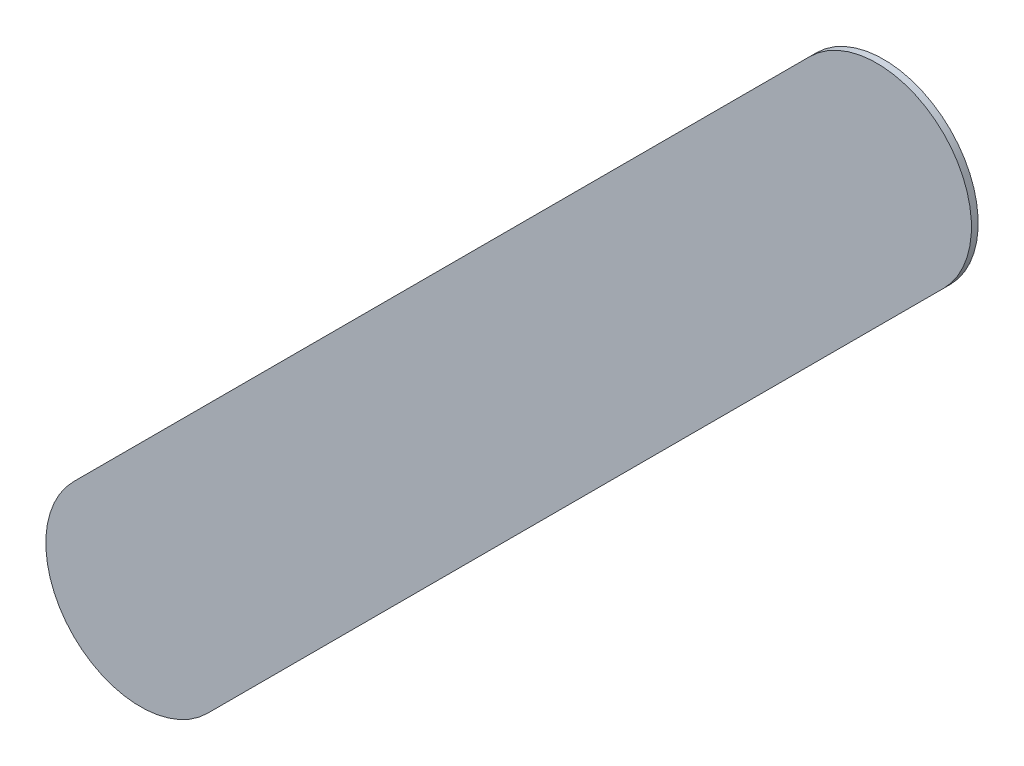
ISO-10303-21;
HEADER;
FILE_DESCRIPTION(('STEP AP214'),'2;1');
FILE_NAME('part.step','',(''),(''),'','','');
FILE_SCHEMA(('AUTOMOTIVE_DESIGN { 1 0 10303 214 1 1 1 1 }'));
ENDSEC;
DATA;
#1=APPLICATION_CONTEXT('core data for automotive mechanical design processes');
#2=APPLICATION_PROTOCOL_DEFINITION('international standard','automotive_design',2000,#1);
#3=PRODUCT_CONTEXT('',#1,'mechanical');
#4=PRODUCT('Part','Part','',(#3));
#5=PRODUCT_RELATED_PRODUCT_CATEGORY('part','',(#4));
#6=PRODUCT_DEFINITION_FORMATION('','',#4);
#7=PRODUCT_DEFINITION_CONTEXT('part definition',#1,'design');
#8=PRODUCT_DEFINITION('design','',#6,#7);
#9=PRODUCT_DEFINITION_SHAPE('','',#8);
#10=(LENGTH_UNIT() NAMED_UNIT(*) SI_UNIT(.MILLI.,.METRE.));
#11=(NAMED_UNIT(*) PLANE_ANGLE_UNIT() SI_UNIT($,.RADIAN.));
#12=(NAMED_UNIT(*) SI_UNIT($,.STERADIAN.) SOLID_ANGLE_UNIT());
#13=UNCERTAINTY_MEASURE_WITH_UNIT(LENGTH_MEASURE(1.E-05),#10,'distance_accuracy_value','');
#14=(GEOMETRIC_REPRESENTATION_CONTEXT(3) GLOBAL_UNCERTAINTY_ASSIGNED_CONTEXT((#13)) GLOBAL_UNIT_ASSIGNED_CONTEXT((#10,
#11,#12)) REPRESENTATION_CONTEXT('',''));
#15=CARTESIAN_POINT('',(0.,0.,0.));
#16=DIRECTION('',(0.,0.,1.));
#17=DIRECTION('',(1.,0.,0.));
#18=AXIS2_PLACEMENT_3D('',#15,#16,#17);
#19=CARTESIAN_POINT('',(35.36272836,117.75563444,0.));
#20=DIRECTION('',(-0.707106781186547,0.707106781186548,0.));
#21=DIRECTION('',(0.707106781186548,0.707106781186547,0.));
#22=AXIS2_PLACEMENT_3D('',#19,#20,#21);
#23=PLANE('',#22);
#24=DIRECTION('',(0.707106781186548,0.707106781186547,0.));
#25=VECTOR('',#24,1.);
#26=CARTESIAN_POINT('',(35.36272836,117.75563444,0.03556));
#27=LINE('',#26,#25);
#28=CARTESIAN_POINT('',(35.36272836,117.75563444,0.03556));
#29=VERTEX_POINT('',#28);
#30=CARTESIAN_POINT('',(39.253541,121.64644708,0.03556));
#31=VERTEX_POINT('',#30);
#32=EDGE_CURVE('E11',#29,#31,#27,.T.);
#33=ORIENTED_EDGE('',*,*,#32,.F.);
#34=DIRECTION('',(0.,0.,1.));
#35=VECTOR('',#34,1.);
#36=CARTESIAN_POINT('',(35.36272836,117.75563444,0.));
#37=LINE('',#36,#35);
#38=CARTESIAN_POINT('',(35.36272836,117.75563444,0.));
#39=VERTEX_POINT('',#38);
#40=EDGE_CURVE('E24',#39,#29,#37,.T.);
#41=ORIENTED_EDGE('',*,*,#40,.F.);
#42=DIRECTION('',(0.707106781186548,0.707106781186547,0.));
#43=VECTOR('',#42,1.);
#44=CARTESIAN_POINT('',(35.36272836,117.75563444,0.));
#45=LINE('',#44,#43);
#46=CARTESIAN_POINT('',(39.253541,121.64644708,0.));
#47=VERTEX_POINT('',#46);
#48=EDGE_CURVE('E75',#39,#47,#45,.T.);
#49=ORIENTED_EDGE('',*,*,#48,.T.);
#50=DIRECTION('',(0.,0.,1.));
#51=VECTOR('',#50,1.);
#52=CARTESIAN_POINT('',(39.253541,121.64644708,0.));
#53=LINE('',#52,#51);
#54=EDGE_CURVE('E37',#47,#31,#53,.T.);
#55=ORIENTED_EDGE('',*,*,#54,.T.);
#56=EDGE_LOOP('',(#33,#41,#49,#55));
#57=FACE_BOUND('',#56,.T.);
#58=ADVANCED_FACE('F17',(#57),#23,.F.);
#59=CARTESIAN_POINT('',(38.89998824,121.99999984,0.));
#60=DIRECTION('',(0.,0.,-1.));
#61=DIRECTION('',(0.707106781186562,-0.707106781186533,0.));
#62=AXIS2_PLACEMENT_3D('',#59,#60,#61);
#63=CYLINDRICAL_SURFACE('',#62,0.499999108206436);
#64=CARTESIAN_POINT('',(38.89998824,121.99999984,0.03556));
#65=DIRECTION('',(0.,0.,1.));
#66=DIRECTION('',(0.707106781186562,-0.707106781186533,0.));
#67=AXIS2_PLACEMENT_3D('',#64,#65,#66);
#68=CIRCLE('',#67,0.499999108206436);
#69=CARTESIAN_POINT('',(38.54643548,122.3535526,0.03556));
#70=VERTEX_POINT('',#69);
#71=EDGE_CURVE('E83',#31,#70,#68,.T.);
#72=ORIENTED_EDGE('',*,*,#71,.F.);
#73=ORIENTED_EDGE('',*,*,#54,.F.);
#74=CARTESIAN_POINT('',(38.89998824,121.99999984,0.));
#75=DIRECTION('',(0.,0.,1.));
#76=DIRECTION('',(0.707106781186562,-0.707106781186533,0.));
#77=AXIS2_PLACEMENT_3D('',#74,#75,#76);
#78=CIRCLE('',#77,0.499999108206436);
#79=CARTESIAN_POINT('',(38.54643548,122.3535526,0.));
#80=VERTEX_POINT('',#79);
#81=EDGE_CURVE('E81',#47,#80,#78,.T.);
#82=ORIENTED_EDGE('',*,*,#81,.T.);
#83=DIRECTION('',(0.,0.,1.));
#84=VECTOR('',#83,1.);
#85=CARTESIAN_POINT('',(38.54643548,122.3535526,0.));
#86=LINE('',#85,#84);
#87=EDGE_CURVE('E67',#80,#70,#86,.T.);
#88=ORIENTED_EDGE('',*,*,#87,.T.);
#89=EDGE_LOOP('',(#72,#73,#82,#88));
#90=FACE_BOUND('',#89,.T.);
#91=ADVANCED_FACE('F89',(#90),#63,.T.);
#92=CARTESIAN_POINT('',(38.54643548,122.3535526,0.));
#93=DIRECTION('',(0.707106781186547,-0.707106781186548,0.));
#94=DIRECTION('',(-0.707106781186548,-0.707106781186547,0.));
#95=AXIS2_PLACEMENT_3D('',#92,#93,#94);
#96=PLANE('',#95);
#97=DIRECTION('',(-0.707106781186548,-0.707106781186547,0.));
#98=VECTOR('',#97,1.);
#99=CARTESIAN_POINT('',(38.54643548,122.3535526,0.03556));
#100=LINE('',#99,#98);
#101=CARTESIAN_POINT('',(34.65562284,118.46273996,0.03556));
#102=VERTEX_POINT('',#101);
#103=EDGE_CURVE('E71',#70,#102,#100,.T.);
#104=ORIENTED_EDGE('',*,*,#103,.F.);
#105=ORIENTED_EDGE('',*,*,#87,.F.);
#106=DIRECTION('',(-0.707106781186548,-0.707106781186547,0.));
#107=VECTOR('',#106,1.);
#108=CARTESIAN_POINT('',(38.54643548,122.3535526,0.));
#109=LINE('',#108,#107);
#110=CARTESIAN_POINT('',(34.65562284,118.46273996,0.));
#111=VERTEX_POINT('',#110);
#112=EDGE_CURVE('E63',#80,#111,#109,.T.);
#113=ORIENTED_EDGE('',*,*,#112,.T.);
#114=DIRECTION('',(0.,0.,1.));
#115=VECTOR('',#114,1.);
#116=CARTESIAN_POINT('',(34.65562284,118.46273996,0.));
#117=LINE('',#116,#115);
#118=EDGE_CURVE('E53',#111,#102,#117,.T.);
#119=ORIENTED_EDGE('',*,*,#118,.T.);
#120=EDGE_LOOP('',(#104,#105,#113,#119));
#121=FACE_BOUND('',#120,.T.);
#122=ADVANCED_FACE('F66',(#121),#96,.F.);
#123=CARTESIAN_POINT('',(35.0091756,118.1091872,0.));
#124=DIRECTION('',(0.,0.,-1.));
#125=DIRECTION('',(-0.707106781186562,0.707106781186533,0.));
#126=AXIS2_PLACEMENT_3D('',#123,#124,#125);
#127=CYLINDRICAL_SURFACE('',#126,0.499999108206436);
#128=CARTESIAN_POINT('',(35.0091756,118.1091872,0.03556));
#129=DIRECTION('',(0.,0.,1.));
#130=DIRECTION('',(-0.707106781186562,0.707106781186533,0.));
#131=AXIS2_PLACEMENT_3D('',#128,#129,#130);
#132=CIRCLE('',#131,0.499999108206436);
#133=EDGE_CURVE('E59',#102,#29,#132,.T.);
#134=ORIENTED_EDGE('',*,*,#133,.F.);
#135=ORIENTED_EDGE('',*,*,#118,.F.);
#136=CARTESIAN_POINT('',(35.0091756,118.1091872,0.));
#137=DIRECTION('',(0.,0.,1.));
#138=DIRECTION('',(-0.707106781186562,0.707106781186533,0.));
#139=AXIS2_PLACEMENT_3D('',#136,#137,#138);
#140=CIRCLE('',#139,0.499999108206436);
#141=EDGE_CURVE('E57',#111,#39,#140,.T.);
#142=ORIENTED_EDGE('',*,*,#141,.T.);
#143=ORIENTED_EDGE('',*,*,#40,.T.);
#144=EDGE_LOOP('',(#134,#135,#142,#143));
#145=FACE_BOUND('',#144,.T.);
#146=ADVANCED_FACE('F55',(#145),#127,.T.);
#147=CARTESIAN_POINT('',(35.36272836,117.75563444,0.));
#148=DIRECTION('',(0.,0.,-1.));
#149=DIRECTION('',(-1.,0.,0.));
#150=AXIS2_PLACEMENT_3D('',#147,#148,#149);
#151=PLANE('',#150);
#152=ORIENTED_EDGE('',*,*,#141,.F.);
#153=ORIENTED_EDGE('',*,*,#112,.F.);
#154=ORIENTED_EDGE('',*,*,#81,.F.);
#155=ORIENTED_EDGE('',*,*,#48,.F.);
#156=EDGE_LOOP('',(#152,#153,#154,#155));
#157=FACE_BOUND('',#156,.T.);
#158=ADVANCED_FACE('F74',(#157),#151,.T.);
#159=CARTESIAN_POINT('',(35.36272836,117.75563444,0.03556));
#160=DIRECTION('',(0.,0.,-1.));
#161=DIRECTION('',(-1.,0.,0.));
#162=AXIS2_PLACEMENT_3D('',#159,#160,#161);
#163=PLANE('',#162);
#164=ORIENTED_EDGE('',*,*,#32,.T.);
#165=ORIENTED_EDGE('',*,*,#71,.T.);
#166=ORIENTED_EDGE('',*,*,#103,.T.);
#167=ORIENTED_EDGE('',*,*,#133,.T.);
#168=EDGE_LOOP('',(#164,#165,#166,#167));
#169=FACE_BOUND('',#168,.T.);
#170=ADVANCED_FACE('F91',(#169),#163,.F.);
#171=CLOSED_SHELL('',(#58,#91,#122,#146,#158,#170));
#172=MANIFOLD_SOLID_BREP('B1',#171);
#173=ADVANCED_BREP_SHAPE_REPRESENTATION('',(#18,#172),#14);
#174=SHAPE_DEFINITION_REPRESENTATION(#9,#173);
ENDSEC;
END-ISO-10303-21;
